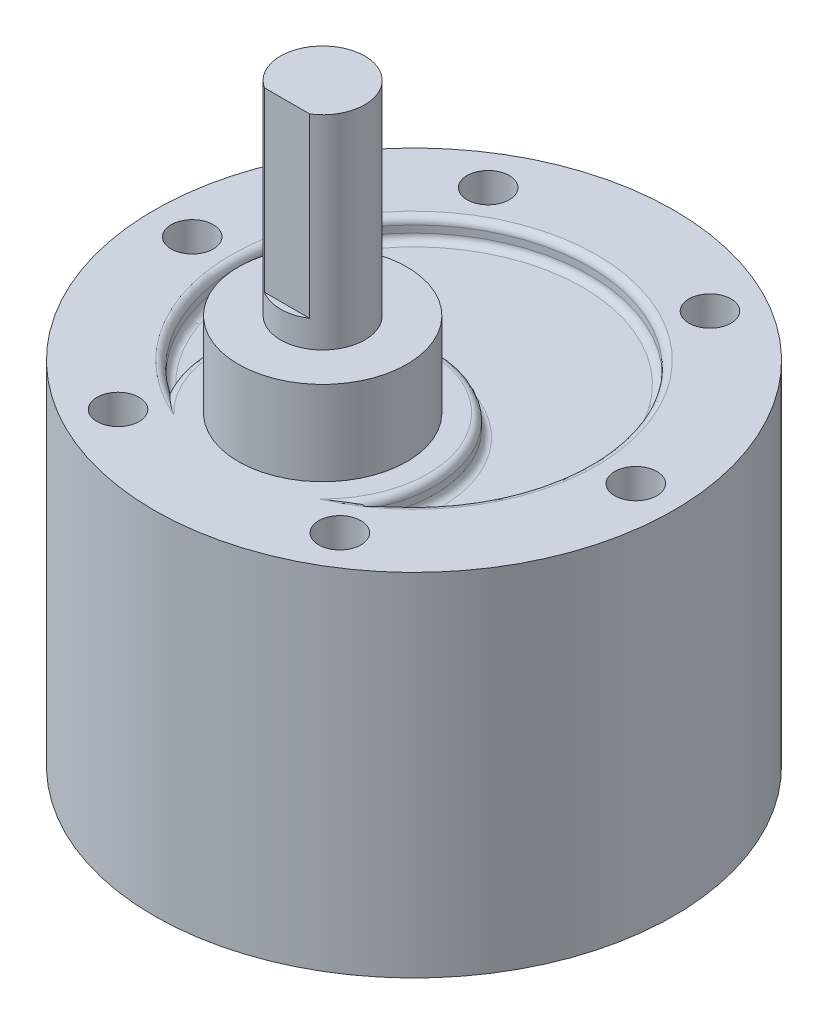
ISO-10303-21;
HEADER;
FILE_DESCRIPTION(('STEP AP214'),'2;1');
FILE_NAME('part.step','',(''),(''),'','','');
FILE_SCHEMA(('AUTOMOTIVE_DESIGN { 1 0 10303 214 1 1 1 1 }'));
ENDSEC;
DATA;
#1=APPLICATION_CONTEXT('core data for automotive mechanical design processes');
#2=APPLICATION_PROTOCOL_DEFINITION('international standard','automotive_design',2000,#1);
#3=PRODUCT_CONTEXT('',#1,'mechanical');
#4=PRODUCT('Part','Part','',(#3));
#5=PRODUCT_RELATED_PRODUCT_CATEGORY('part','',(#4));
#6=PRODUCT_DEFINITION_FORMATION('','',#4);
#7=PRODUCT_DEFINITION_CONTEXT('part definition',#1,'design');
#8=PRODUCT_DEFINITION('design','',#6,#7);
#9=PRODUCT_DEFINITION_SHAPE('','',#8);
#10=(LENGTH_UNIT() NAMED_UNIT(*) SI_UNIT(.MILLI.,.METRE.));
#11=(NAMED_UNIT(*) PLANE_ANGLE_UNIT() SI_UNIT($,.RADIAN.));
#12=(NAMED_UNIT(*) SI_UNIT($,.STERADIAN.) SOLID_ANGLE_UNIT());
#13=UNCERTAINTY_MEASURE_WITH_UNIT(LENGTH_MEASURE(1.E-05),#10,'distance_accuracy_value','');
#14=(GEOMETRIC_REPRESENTATION_CONTEXT(3) GLOBAL_UNCERTAINTY_ASSIGNED_CONTEXT((#13)) GLOBAL_UNIT_ASSIGNED_CONTEXT((#10,
#11,#12)) REPRESENTATION_CONTEXT('',''));
#15=CARTESIAN_POINT('',(0.,0.,0.));
#16=DIRECTION('',(0.,0.,1.));
#17=DIRECTION('',(1.,0.,0.));
#18=AXIS2_PLACEMENT_3D('',#15,#16,#17);
#19=CARTESIAN_POINT('',(0.,23.5,0.));
#20=DIRECTION('',(0.,1.,0.));
#21=DIRECTION('',(0.,0.,1.));
#22=AXIS2_PLACEMENT_3D('',#19,#20,#21);
#23=CYLINDRICAL_SURFACE('',#22,12.5);
#24=DIRECTION('',(0.,-1.,0.));
#25=VECTOR('',#24,1.);
#26=CARTESIAN_POINT('',(-7.014777301648,24.25,10.3461538461538));
#27=LINE('',#26,#25);
#28=CARTESIAN_POINT('',(-7.014777301648,24.,10.3461538461538));
#29=VERTEX_POINT('',#28);
#30=CARTESIAN_POINT('',(-7.014777301648,24.5,10.3461538461538));
#31=VERTEX_POINT('',#30);
#32=EDGE_CURVE('E162',#29,#31,#27,.F.);
#33=ORIENTED_EDGE('',*,*,#32,.F.);
#34=CARTESIAN_POINT('',(0.,24.,0.));
#35=DIRECTION('',(0.,1.,0.));
#36=DIRECTION('',(0.,0.,1.));
#37=AXIS2_PLACEMENT_3D('',#34,#35,#36);
#38=CIRCLE('',#37,12.5);
#39=CARTESIAN_POINT('',(7.014777301648,24.,10.3461538461538));
#40=VERTEX_POINT('',#39);
#41=EDGE_CURVE('E11',#29,#40,#38,.F.);
#42=ORIENTED_EDGE('',*,*,#41,.T.);
#43=DIRECTION('',(0.,-1.,0.));
#44=VECTOR('',#43,1.);
#45=CARTESIAN_POINT('',(7.014777301648,24.25,10.3461538461538));
#46=LINE('',#45,#44);
#47=CARTESIAN_POINT('',(7.014777301648,24.5,10.3461538461538));
#48=VERTEX_POINT('',#47);
#49=EDGE_CURVE('E165',#48,#40,#46,.T.);
#50=ORIENTED_EDGE('',*,*,#49,.F.);
#51=CARTESIAN_POINT('',(0.,24.5,0.));
#52=DIRECTION('',(0.,1.,0.));
#53=DIRECTION('',(0.,0.,1.));
#54=AXIS2_PLACEMENT_3D('',#51,#52,#53);
#55=CIRCLE('',#54,12.5);
#56=EDGE_CURVE('E48',#48,#31,#55,.T.);
#57=ORIENTED_EDGE('',*,*,#56,.T.);
#58=EDGE_LOOP('',(#33,#42,#50,#57));
#59=FACE_BOUND('',#58,.T.);
#60=ADVANCED_FACE('F34',(#59),#23,.F.);
#61=CARTESIAN_POINT('',(0.,25.,0.));
#62=DIRECTION('',(0.,-1.,0.));
#63=DIRECTION('',(0.,0.,-1.));
#64=AXIS2_PLACEMENT_3D('',#61,#62,#63);
#65=CYLINDRICAL_SURFACE('',#64,18.5);
#66=CARTESIAN_POINT('',(0.,25.,0.));
#67=DIRECTION('',(0.,1.,0.));
#68=DIRECTION('',(0.,0.,1.));
#69=AXIS2_PLACEMENT_3D('',#66,#67,#68);
#70=CIRCLE('',#69,18.5);
#71=CARTESIAN_POINT('',(0.,25.,18.5));
#72=VERTEX_POINT('',#71);
#73=EDGE_CURVE('E169',#72,#72,#70,.T.);
#74=ORIENTED_EDGE('',*,*,#73,.F.);
#75=EDGE_LOOP('',(#74));
#76=FACE_BOUND('',#75,.T.);
#77=CARTESIAN_POINT('',(0.,0.,0.));
#78=DIRECTION('',(0.,1.,0.));
#79=DIRECTION('',(0.,0.,1.));
#80=AXIS2_PLACEMENT_3D('',#77,#78,#79);
#81=CIRCLE('',#80,18.5);
#82=CARTESIAN_POINT('',(0.,0.,18.5));
#83=VERTEX_POINT('',#82);
#84=EDGE_CURVE('E168',#83,#83,#81,.T.);
#85=ORIENTED_EDGE('',*,*,#84,.T.);
#86=EDGE_LOOP('',(#85));
#87=FACE_BOUND('',#86,.T.);
#88=ADVANCED_FACE('F252',(#76,#87),#65,.T.);
#89=CARTESIAN_POINT('',(0.,25.,0.));
#90=DIRECTION('',(0.,1.,0.));
#91=DIRECTION('',(0.,0.,1.));
#92=AXIS2_PLACEMENT_3D('',#89,#90,#91);
#93=PLANE('',#92);
#94=CARTESIAN_POINT('',(0.,25.,0.));
#95=DIRECTION('',(0.,1.,0.));
#96=DIRECTION('',(0.,0.,1.));
#97=AXIS2_PLACEMENT_3D('',#94,#95,#96);
#98=CIRCLE('',#97,13.);
#99=CARTESIAN_POINT('',(-5.180756381687,25.,11.9230769230769));
#100=VERTEX_POINT('',#99);
#101=CARTESIAN_POINT('',(5.180756381687,25.,11.9230769230769));
#102=VERTEX_POINT('',#101);
#103=EDGE_CURVE('E63',#100,#102,#98,.F.);
#104=ORIENTED_EDGE('',*,*,#103,.T.);
#105=CARTESIAN_POINT('',(0.,25.,6.5));
#106=DIRECTION('',(0.,1.,0.));
#107=DIRECTION('',(0.,0.,1.));
#108=AXIS2_PLACEMENT_3D('',#105,#106,#107);
#109=CIRCLE('',#108,7.5);
#110=EDGE_CURVE('E186',#102,#100,#109,.T.);
#111=ORIENTED_EDGE('',*,*,#110,.T.);
#112=EDGE_LOOP('',(#104,#111));
#113=FACE_BOUND('',#112,.T.);
#114=CARTESIAN_POINT('',(15.4973401244707,25.,-0.287139454742051));
#115=DIRECTION('',(0.,1.,0.));
#116=DIRECTION('',(0.866025403784436,0.,-0.500000000000004));
#117=AXIS2_PLACEMENT_3D('',#114,#115,#116);
#118=CIRCLE('',#117,1.5);
#119=CARTESIAN_POINT('',(16.7963782301474,25.,-1.03713945474206));
#120=VERTEX_POINT('',#119);
#121=EDGE_CURVE('E119',#120,#120,#118,.T.);
#122=ORIENTED_EDGE('',*,*,#121,.F.);
#123=EDGE_LOOP('',(#122));
#124=FACE_BOUND('',#123,.T.);
#125=CARTESIAN_POINT('',(7.5,25.,-13.5646599662505));
#126=DIRECTION('',(0.,1.,0.));
#127=DIRECTION('',(0.,0.,-1.));
#128=AXIS2_PLACEMENT_3D('',#125,#126,#127);
#129=CIRCLE('',#128,1.5);
#130=CARTESIAN_POINT('',(7.5,25.,-15.0646599662505));
#131=VERTEX_POINT('',#130);
#132=EDGE_CURVE('E125',#131,#131,#129,.T.);
#133=ORIENTED_EDGE('',*,*,#132,.F.);
#134=EDGE_LOOP('',(#133));
#135=FACE_BOUND('',#134,.T.);
#136=CARTESIAN_POINT('',(-7.99734012447086,25.,-13.2775205115085));
#137=DIRECTION('',(0.,1.,0.));
#138=DIRECTION('',(-0.866025403784443,0.,-0.499999999999992));
#139=AXIS2_PLACEMENT_3D('',#136,#137,#138);
#140=CIRCLE('',#139,1.5);
#141=CARTESIAN_POINT('',(-9.29637823014752,25.,-14.0275205115085));
#142=VERTEX_POINT('',#141);
#143=EDGE_CURVE('E131',#142,#142,#140,.T.);
#144=ORIENTED_EDGE('',*,*,#143,.F.);
#145=EDGE_LOOP('',(#144));
#146=FACE_BOUND('',#145,.T.);
#147=CARTESIAN_POINT('',(-15.4973401244707,25.,0.28713945474216));
#148=DIRECTION('',(0.,1.,0.));
#149=DIRECTION('',(-0.866025403784433,0.,0.50000000000001));
#150=AXIS2_PLACEMENT_3D('',#147,#148,#149);
#151=CIRCLE('',#150,1.5);
#152=CARTESIAN_POINT('',(-16.7963782301474,25.,1.03713945474218));
#153=VERTEX_POINT('',#152);
#154=EDGE_CURVE('E137',#153,#153,#151,.T.);
#155=ORIENTED_EDGE('',*,*,#154,.F.);
#156=EDGE_LOOP('',(#155));
#157=FACE_BOUND('',#156,.T.);
#158=CARTESIAN_POINT('',(7.99734012447076,25.,13.2775205115085));
#159=DIRECTION('',(0.,1.,0.));
#160=DIRECTION('',(0.86602540378444,0.,0.499999999999998));
#161=AXIS2_PLACEMENT_3D('',#158,#159,#160);
#162=CIRCLE('',#161,1.5);
#163=CARTESIAN_POINT('',(9.29637823014743,25.,14.0275205115085));
#164=VERTEX_POINT('',#163);
#165=EDGE_CURVE('E118',#164,#164,#162,.T.);
#166=ORIENTED_EDGE('',*,*,#165,.F.);
#167=EDGE_LOOP('',(#166));
#168=FACE_BOUND('',#167,.T.);
#169=CARTESIAN_POINT('',(-7.5,25.,13.5646599662505));
#170=DIRECTION('',(0.,1.,0.));
#171=DIRECTION('',(0.,0.,1.));
#172=AXIS2_PLACEMENT_3D('',#169,#170,#171);
#173=CIRCLE('',#172,1.5);
#174=CARTESIAN_POINT('',(-7.5,25.,15.0646599662505));
#175=VERTEX_POINT('',#174);
#176=EDGE_CURVE('E144',#175,#175,#173,.T.);
#177=ORIENTED_EDGE('',*,*,#176,.F.);
#178=EDGE_LOOP('',(#177));
#179=FACE_BOUND('',#178,.T.);
#180=ORIENTED_EDGE('',*,*,#73,.T.);
#181=EDGE_LOOP('',(#180));
#182=FACE_BOUND('',#181,.T.);
#183=CARTESIAN_POINT('',(0.,25.,6.5));
#184=DIRECTION('',(0.,1.,0.));
#185=DIRECTION('',(0.,0.,1.));
#186=AXIS2_PLACEMENT_3D('',#183,#184,#185);
#187=CIRCLE('',#186,6.);
#188=CARTESIAN_POINT('',(0.,25.,12.5));
#189=VERTEX_POINT('',#188);
#190=EDGE_CURVE('E159',#189,#189,#187,.T.);
#191=ORIENTED_EDGE('',*,*,#190,.F.);
#192=EDGE_LOOP('',(#191));
#193=FACE_BOUND('',#192,.T.);
#194=ADVANCED_FACE('F247',(#113,#124,#135,#146,#157,#168,#179,#182,#193),#93,.T.);
#195=CARTESIAN_POINT('',(0.,0.,0.));
#196=DIRECTION('',(0.,1.,0.));
#197=DIRECTION('',(0.,0.,1.));
#198=AXIS2_PLACEMENT_3D('',#195,#196,#197);
#199=PLANE('',#198);
#200=ORIENTED_EDGE('',*,*,#84,.F.);
#201=EDGE_LOOP('',(#200));
#202=FACE_BOUND('',#201,.T.);
#203=ADVANCED_FACE('F239',(#202),#199,.F.);
#204=CARTESIAN_POINT('',(0.,23.5,0.));
#205=DIRECTION('',(0.,1.,0.));
#206=DIRECTION('',(0.,0.,1.));
#207=AXIS2_PLACEMENT_3D('',#204,#205,#206);
#208=PLANE('',#207);
#209=CARTESIAN_POINT('',(0.,23.5,0.));
#210=DIRECTION('',(0.,1.,0.));
#211=DIRECTION('',(0.,0.,1.));
#212=AXIS2_PLACEMENT_3D('',#209,#210,#211);
#213=CIRCLE('',#212,12.);
#214=CARTESIAN_POINT('',(8.19149508429178,23.5,8.76923076923077));
#215=VERTEX_POINT('',#214);
#216=CARTESIAN_POINT('',(-8.19149508429178,23.5,8.76923076923077));
#217=VERTEX_POINT('',#216);
#218=EDGE_CURVE('E180',#215,#217,#213,.T.);
#219=ORIENTED_EDGE('',*,*,#218,.T.);
#220=CARTESIAN_POINT('',(0.,23.5,6.5));
#221=DIRECTION('',(0.,1.,0.));
#222=DIRECTION('',(0.,0.,1.));
#223=AXIS2_PLACEMENT_3D('',#220,#221,#222);
#224=CIRCLE('',#223,8.5);
#225=EDGE_CURVE('E182',#217,#215,#224,.F.);
#226=ORIENTED_EDGE('',*,*,#225,.T.);
#227=EDGE_LOOP('',(#219,#226));
#228=FACE_BOUND('',#227,.T.);
#229=ADVANCED_FACE('F237',(#228),#208,.T.);
#230=CARTESIAN_POINT('',(0.,25.,6.5));
#231=DIRECTION('',(0.,-1.,0.));
#232=DIRECTION('',(0.,0.,-1.));
#233=AXIS2_PLACEMENT_3D('',#230,#231,#232);
#234=CYLINDRICAL_SURFACE('',#233,8.);
#235=ORIENTED_EDGE('',*,*,#49,.T.);
#236=CARTESIAN_POINT('',(0.,24.,6.5));
#237=DIRECTION('',(0.,1.,0.));
#238=DIRECTION('',(0.,0.,1.));
#239=AXIS2_PLACEMENT_3D('',#236,#237,#238);
#240=CIRCLE('',#239,8.);
#241=EDGE_CURVE('E177',#40,#29,#240,.T.);
#242=ORIENTED_EDGE('',*,*,#241,.T.);
#243=ORIENTED_EDGE('',*,*,#32,.T.);
#244=CARTESIAN_POINT('',(0.,24.5,6.5));
#245=DIRECTION('',(0.,1.,0.));
#246=DIRECTION('',(0.,0.,1.));
#247=AXIS2_PLACEMENT_3D('',#244,#245,#246);
#248=CIRCLE('',#247,8.);
#249=EDGE_CURVE('E172',#31,#48,#248,.F.);
#250=ORIENTED_EDGE('',*,*,#249,.T.);
#251=EDGE_LOOP('',(#235,#242,#243,#250));
#252=FACE_BOUND('',#251,.T.);
#253=ADVANCED_FACE('F228',(#252),#234,.T.);
#254=CARTESIAN_POINT('',(0.,31.,6.5));
#255=DIRECTION('',(0.,-1.,0.));
#256=DIRECTION('',(0.,0.,-1.));
#257=AXIS2_PLACEMENT_3D('',#254,#255,#256);
#258=CYLINDRICAL_SURFACE('',#257,6.);
#259=ORIENTED_EDGE('',*,*,#190,.T.);
#260=EDGE_LOOP('',(#259));
#261=FACE_BOUND('',#260,.T.);
#262=CARTESIAN_POINT('',(0.,31.,6.5));
#263=DIRECTION('',(0.,1.,0.));
#264=DIRECTION('',(0.,0.,1.));
#265=AXIS2_PLACEMENT_3D('',#262,#263,#264);
#266=CIRCLE('',#265,6.);
#267=CARTESIAN_POINT('',(0.,31.,12.5));
#268=VERTEX_POINT('',#267);
#269=EDGE_CURVE('E154',#268,#268,#266,.T.);
#270=ORIENTED_EDGE('',*,*,#269,.F.);
#271=EDGE_LOOP('',(#270));
#272=FACE_BOUND('',#271,.T.);
#273=ADVANCED_FACE('F245',(#261,#272),#258,.T.);
#274=CARTESIAN_POINT('',(0.,31.,6.5));
#275=DIRECTION('',(0.,1.,0.));
#276=DIRECTION('',(0.,0.,1.));
#277=AXIS2_PLACEMENT_3D('',#274,#275,#276);
#278=PLANE('',#277);
#279=CARTESIAN_POINT('',(0.,31.,6.5));
#280=DIRECTION('',(0.,1.,0.));
#281=DIRECTION('',(0.,0.,1.));
#282=AXIS2_PLACEMENT_3D('',#279,#280,#281);
#283=CIRCLE('',#282,3.);
#284=CARTESIAN_POINT('',(0.,31.,9.5));
#285=VERTEX_POINT('',#284);
#286=EDGE_CURVE('E150',#285,#285,#283,.T.);
#287=ORIENTED_EDGE('',*,*,#286,.F.);
#288=EDGE_LOOP('',(#287));
#289=FACE_BOUND('',#288,.T.);
#290=ORIENTED_EDGE('',*,*,#269,.T.);
#291=EDGE_LOOP('',(#290));
#292=FACE_BOUND('',#291,.T.);
#293=ADVANCED_FACE('F280',(#289,#292),#278,.T.);
#294=CARTESIAN_POINT('',(0.,45.5,6.5));
#295=DIRECTION('',(0.,-1.,0.));
#296=DIRECTION('',(0.,0.,-1.));
#297=AXIS2_PLACEMENT_3D('',#294,#295,#296);
#298=CYLINDRICAL_SURFACE('',#297,3.);
#299=CARTESIAN_POINT('',(0.,45.5,6.5));
#300=DIRECTION('',(0.,1.,0.));
#301=DIRECTION('',(0.,0.,1.));
#302=AXIS2_PLACEMENT_3D('',#299,#300,#301);
#303=CIRCLE('',#302,3.);
#304=CARTESIAN_POINT('',(1.61,45.5,9.03138302119612));
#305=VERTEX_POINT('',#304);
#306=CARTESIAN_POINT('',(-1.61,45.5,9.03138302119612));
#307=VERTEX_POINT('',#306);
#308=EDGE_CURVE('E109',#305,#307,#303,.T.);
#309=ORIENTED_EDGE('',*,*,#308,.F.);
#310=DIRECTION('',(0.,1.,0.));
#311=VECTOR('',#310,1.);
#312=CARTESIAN_POINT('',(1.61,32.9,9.03138302119612));
#313=LINE('',#312,#311);
#314=CARTESIAN_POINT('',(1.61,32.9,9.03138302119612));
#315=VERTEX_POINT('',#314);
#316=EDGE_CURVE('E56',#315,#305,#313,.T.);
#317=ORIENTED_EDGE('',*,*,#316,.F.);
#318=CARTESIAN_POINT('',(0.,32.9,6.5));
#319=DIRECTION('',(0.,1.,0.));
#320=DIRECTION('',(0.,0.,1.));
#321=AXIS2_PLACEMENT_3D('',#318,#319,#320);
#322=CIRCLE('',#321,3.);
#323=CARTESIAN_POINT('',(-1.61,32.9,9.03138302119612));
#324=VERTEX_POINT('',#323);
#325=EDGE_CURVE('E95',#324,#315,#322,.T.);
#326=ORIENTED_EDGE('',*,*,#325,.F.);
#327=DIRECTION('',(0.,1.,0.));
#328=VECTOR('',#327,1.);
#329=CARTESIAN_POINT('',(-1.61,32.9,9.03138302119612));
#330=LINE('',#329,#328);
#331=EDGE_CURVE('E103',#324,#307,#330,.T.);
#332=ORIENTED_EDGE('',*,*,#331,.T.);
#333=EDGE_LOOP('',(#309,#317,#326,#332));
#334=FACE_BOUND('',#333,.T.);
#335=ORIENTED_EDGE('',*,*,#286,.T.);
#336=EDGE_LOOP('',(#335));
#337=FACE_BOUND('',#336,.T.);
#338=ADVANCED_FACE('F106',(#334,#337),#298,.T.);
#339=CARTESIAN_POINT('',(0.,45.5,6.5));
#340=DIRECTION('',(0.,1.,0.));
#341=DIRECTION('',(0.,0.,1.));
#342=AXIS2_PLACEMENT_3D('',#339,#340,#341);
#343=PLANE('',#342);
#344=DIRECTION('',(-1.,0.,0.));
#345=VECTOR('',#344,1.);
#346=CARTESIAN_POINT('',(-1.61,45.5,9.03138302119612));
#347=LINE('',#346,#345);
#348=EDGE_CURVE('E100',#305,#307,#347,.T.);
#349=ORIENTED_EDGE('',*,*,#348,.F.);
#350=ORIENTED_EDGE('',*,*,#308,.T.);
#351=EDGE_LOOP('',(#349,#350));
#352=FACE_BOUND('',#351,.T.);
#353=ADVANCED_FACE('F290',(#352),#343,.T.);
#354=CARTESIAN_POINT('',(-7.5,21.,13.5646599662505));
#355=DIRECTION('',(0.,1.,0.));
#356=DIRECTION('',(0.,0.,1.));
#357=AXIS2_PLACEMENT_3D('',#354,#355,#356);
#358=CYLINDRICAL_SURFACE('',#357,1.5);
#359=CARTESIAN_POINT('',(-7.5,21.,13.5646599662505));
#360=DIRECTION('',(0.,1.,0.));
#361=DIRECTION('',(0.,0.,1.));
#362=AXIS2_PLACEMENT_3D('',#359,#360,#361);
#363=CIRCLE('',#362,1.5);
#364=CARTESIAN_POINT('',(-7.5,21.,15.0646599662505));
#365=VERTEX_POINT('',#364);
#366=EDGE_CURVE('E147',#365,#365,#363,.T.);
#367=ORIENTED_EDGE('',*,*,#366,.F.);
#368=EDGE_LOOP('',(#367));
#369=FACE_BOUND('',#368,.T.);
#370=ORIENTED_EDGE('',*,*,#176,.T.);
#371=EDGE_LOOP('',(#370));
#372=FACE_BOUND('',#371,.T.);
#373=ADVANCED_FACE('F296',(#369,#372),#358,.F.);
#374=CARTESIAN_POINT('',(0.,21.,0.));
#375=DIRECTION('',(0.,1.,0.));
#376=DIRECTION('',(0.,0.,1.));
#377=AXIS2_PLACEMENT_3D('',#374,#375,#376);
#378=PLANE('',#377);
#379=ORIENTED_EDGE('',*,*,#366,.T.);
#380=EDGE_LOOP('',(#379));
#381=FACE_BOUND('',#380,.T.);
#382=ADVANCED_FACE('F300',(#381),#378,.T.);
#383=CARTESIAN_POINT('',(7.99734012447076,21.,13.2775205115085));
#384=DIRECTION('',(0.,1.,0.));
#385=DIRECTION('',(0.,0.,1.));
#386=AXIS2_PLACEMENT_3D('',#383,#384,#385);
#387=CYLINDRICAL_SURFACE('',#386,1.5);
#388=CARTESIAN_POINT('',(7.99734012447076,21.,13.2775205115085));
#389=DIRECTION('',(0.,1.,0.));
#390=DIRECTION('',(0.86602540378444,0.,0.499999999999998));
#391=AXIS2_PLACEMENT_3D('',#388,#389,#390);
#392=CIRCLE('',#391,1.5);
#393=CARTESIAN_POINT('',(9.29637823014743,21.,14.0275205115085));
#394=VERTEX_POINT('',#393);
#395=EDGE_CURVE('E141',#394,#394,#392,.T.);
#396=ORIENTED_EDGE('',*,*,#395,.F.);
#397=EDGE_LOOP('',(#396));
#398=FACE_BOUND('',#397,.T.);
#399=ORIENTED_EDGE('',*,*,#165,.T.);
#400=EDGE_LOOP('',(#399));
#401=FACE_BOUND('',#400,.T.);
#402=ADVANCED_FACE('F304',(#398,#401),#387,.F.);
#403=CARTESIAN_POINT('',(0.,21.,0.));
#404=DIRECTION('',(0.,1.,0.));
#405=DIRECTION('',(0.86602540378444,0.,0.499999999999998));
#406=AXIS2_PLACEMENT_3D('',#403,#404,#405);
#407=PLANE('',#406);
#408=ORIENTED_EDGE('',*,*,#395,.T.);
#409=EDGE_LOOP('',(#408));
#410=FACE_BOUND('',#409,.T.);
#411=ADVANCED_FACE('F308',(#410),#407,.T.);
#412=CARTESIAN_POINT('',(-15.4973401244707,21.,0.28713945474216));
#413=DIRECTION('',(0.,1.,0.));
#414=DIRECTION('',(0.,0.,1.));
#415=AXIS2_PLACEMENT_3D('',#412,#413,#414);
#416=CYLINDRICAL_SURFACE('',#415,1.5);
#417=CARTESIAN_POINT('',(-15.4973401244707,21.,0.28713945474216));
#418=DIRECTION('',(0.,1.,0.));
#419=DIRECTION('',(-0.866025403784433,0.,0.50000000000001));
#420=AXIS2_PLACEMENT_3D('',#417,#418,#419);
#421=CIRCLE('',#420,1.5);
#422=CARTESIAN_POINT('',(-16.7963782301474,21.,1.03713945474218));
#423=VERTEX_POINT('',#422);
#424=EDGE_CURVE('E134',#423,#423,#421,.T.);
#425=ORIENTED_EDGE('',*,*,#424,.F.);
#426=EDGE_LOOP('',(#425));
#427=FACE_BOUND('',#426,.T.);
#428=ORIENTED_EDGE('',*,*,#154,.T.);
#429=EDGE_LOOP('',(#428));
#430=FACE_BOUND('',#429,.T.);
#431=ADVANCED_FACE('F312',(#427,#430),#416,.F.);
#432=CARTESIAN_POINT('',(0.,21.,0.));
#433=DIRECTION('',(0.,1.,0.));
#434=DIRECTION('',(-0.866025403784433,0.,0.50000000000001));
#435=AXIS2_PLACEMENT_3D('',#432,#433,#434);
#436=PLANE('',#435);
#437=ORIENTED_EDGE('',*,*,#424,.T.);
#438=EDGE_LOOP('',(#437));
#439=FACE_BOUND('',#438,.T.);
#440=ADVANCED_FACE('F316',(#439),#436,.T.);
#441=CARTESIAN_POINT('',(-7.99734012447086,21.,-13.2775205115085));
#442=DIRECTION('',(0.,1.,0.));
#443=DIRECTION('',(0.,0.,1.));
#444=AXIS2_PLACEMENT_3D('',#441,#442,#443);
#445=CYLINDRICAL_SURFACE('',#444,1.5);
#446=CARTESIAN_POINT('',(-7.99734012447086,21.,-13.2775205115085));
#447=DIRECTION('',(0.,1.,0.));
#448=DIRECTION('',(-0.866025403784443,0.,-0.499999999999992));
#449=AXIS2_PLACEMENT_3D('',#446,#447,#448);
#450=CIRCLE('',#449,1.5);
#451=CARTESIAN_POINT('',(-9.29637823014752,21.,-14.0275205115085));
#452=VERTEX_POINT('',#451);
#453=EDGE_CURVE('E128',#452,#452,#450,.T.);
#454=ORIENTED_EDGE('',*,*,#453,.F.);
#455=EDGE_LOOP('',(#454));
#456=FACE_BOUND('',#455,.T.);
#457=ORIENTED_EDGE('',*,*,#143,.T.);
#458=EDGE_LOOP('',(#457));
#459=FACE_BOUND('',#458,.T.);
#460=ADVANCED_FACE('F320',(#456,#459),#445,.F.);
#461=CARTESIAN_POINT('',(0.,21.,0.));
#462=DIRECTION('',(0.,1.,0.));
#463=DIRECTION('',(-0.866025403784443,0.,-0.499999999999992));
#464=AXIS2_PLACEMENT_3D('',#461,#462,#463);
#465=PLANE('',#464);
#466=ORIENTED_EDGE('',*,*,#453,.T.);
#467=EDGE_LOOP('',(#466));
#468=FACE_BOUND('',#467,.T.);
#469=ADVANCED_FACE('F324',(#468),#465,.T.);
#470=CARTESIAN_POINT('',(7.5,21.,-13.5646599662505));
#471=DIRECTION('',(0.,1.,0.));
#472=DIRECTION('',(0.,0.,1.));
#473=AXIS2_PLACEMENT_3D('',#470,#471,#472);
#474=CYLINDRICAL_SURFACE('',#473,1.5);
#475=CARTESIAN_POINT('',(7.5,21.,-13.5646599662505));
#476=DIRECTION('',(0.,1.,0.));
#477=DIRECTION('',(0.,0.,-1.));
#478=AXIS2_PLACEMENT_3D('',#475,#476,#477);
#479=CIRCLE('',#478,1.5);
#480=CARTESIAN_POINT('',(7.5,21.,-15.0646599662505));
#481=VERTEX_POINT('',#480);
#482=EDGE_CURVE('E122',#481,#481,#479,.T.);
#483=ORIENTED_EDGE('',*,*,#482,.F.);
#484=EDGE_LOOP('',(#483));
#485=FACE_BOUND('',#484,.T.);
#486=ORIENTED_EDGE('',*,*,#132,.T.);
#487=EDGE_LOOP('',(#486));
#488=FACE_BOUND('',#487,.T.);
#489=ADVANCED_FACE('F328',(#485,#488),#474,.F.);
#490=CARTESIAN_POINT('',(0.,21.,0.));
#491=DIRECTION('',(0.,1.,0.));
#492=DIRECTION('',(0.,0.,-1.));
#493=AXIS2_PLACEMENT_3D('',#490,#491,#492);
#494=PLANE('',#493);
#495=ORIENTED_EDGE('',*,*,#482,.T.);
#496=EDGE_LOOP('',(#495));
#497=FACE_BOUND('',#496,.T.);
#498=ADVANCED_FACE('F332',(#497),#494,.T.);
#499=CARTESIAN_POINT('',(15.4973401244707,21.,-0.287139454742051));
#500=DIRECTION('',(0.,1.,0.));
#501=DIRECTION('',(0.,0.,1.));
#502=AXIS2_PLACEMENT_3D('',#499,#500,#501);
#503=CYLINDRICAL_SURFACE('',#502,1.5);
#504=CARTESIAN_POINT('',(15.4973401244707,21.,-0.287139454742051));
#505=DIRECTION('',(0.,1.,0.));
#506=DIRECTION('',(0.866025403784436,0.,-0.500000000000004));
#507=AXIS2_PLACEMENT_3D('',#504,#505,#506);
#508=CIRCLE('',#507,1.5);
#509=CARTESIAN_POINT('',(16.7963782301474,21.,-1.03713945474206));
#510=VERTEX_POINT('',#509);
#511=EDGE_CURVE('E115',#510,#510,#508,.T.);
#512=ORIENTED_EDGE('',*,*,#511,.F.);
#513=EDGE_LOOP('',(#512));
#514=FACE_BOUND('',#513,.T.);
#515=ORIENTED_EDGE('',*,*,#121,.T.);
#516=EDGE_LOOP('',(#515));
#517=FACE_BOUND('',#516,.T.);
#518=ADVANCED_FACE('F336',(#514,#517),#503,.F.);
#519=CARTESIAN_POINT('',(0.,21.,0.));
#520=DIRECTION('',(0.,1.,0.));
#521=DIRECTION('',(0.866025403784436,0.,-0.500000000000004));
#522=AXIS2_PLACEMENT_3D('',#519,#520,#521);
#523=PLANE('',#522);
#524=ORIENTED_EDGE('',*,*,#511,.T.);
#525=EDGE_LOOP('',(#524));
#526=FACE_BOUND('',#525,.T.);
#527=ADVANCED_FACE('F207',(#526),#523,.T.);
#528=CARTESIAN_POINT('',(0.,24.,0.));
#529=DIRECTION('',(0.,1.,0.));
#530=DIRECTION('',(0.,0.,1.));
#531=AXIS2_PLACEMENT_3D('',#528,#529,#530);
#532=TOROIDAL_SURFACE('',#531,12.,0.5);
#533=CARTESIAN_POINT('',(-7.014777301648,24.,10.3461538461538));
#534=CARTESIAN_POINT('',(-7.01475442918476,23.9915923736462,10.3461784879439));
#535=CARTESIAN_POINT('',(-7.01538477166337,23.9832396623425,10.3454862693069));
#536=CARTESIAN_POINT('',(-7.01772080007973,23.9670206322712,10.3429177941814));
#537=CARTESIAN_POINT('',(-7.01940715045433,23.9591483030969,10.3410628270888));
#538=CARTESIAN_POINT('',(-7.02413757927974,23.9421583884327,10.3358533875347));
#539=CARTESIAN_POINT('',(-7.02740813013303,23.9331852546101,10.3322483776561));
#540=CARTESIAN_POINT('',(-7.03485906977461,23.9160706486679,10.3240197451808));
#541=CARTESIAN_POINT('',(-7.03904598852707,23.9079357956427,10.3193888088627));
#542=CARTESIAN_POINT('',(-7.05178893466808,23.8859344305451,10.3052631403329));
#543=CARTESIAN_POINT('',(-7.0610536750115,23.8730142340979,10.2949581215688));
#544=CARTESIAN_POINT('',(-7.08056058954089,23.8491280867938,10.2731582004436));
#545=CARTESIAN_POINT('',(-7.09080449283763,23.8381656949054,10.2616611899885));
#546=CARTESIAN_POINT('',(-7.11876199646768,23.8108780437832,10.2301274294606));
#547=CARTESIAN_POINT('',(-7.1369478967437,23.7957816693751,10.2094575664443));
#548=CARTESIAN_POINT('',(-7.17394885718459,23.7680463846059,10.1670344783538));
#549=CARTESIAN_POINT('',(-7.19276536295881,23.7554136481851,10.1452786988679));
#550=CARTESIAN_POINT('',(-7.23078286073721,23.7318630689856,10.1009298317673));
#551=CARTESIAN_POINT('',(-7.24998546439757,23.7209557630854,10.0783325678163));
#552=CARTESIAN_POINT('',(-7.28846237127119,23.700532816483,10.0326401770113));
#553=CARTESIAN_POINT('',(-7.30773656176675,23.6910155327911,10.009545675565));
#554=CARTESIAN_POINT('',(-7.36525926504657,23.664238506994,9.93998425454603));
#555=CARTESIAN_POINT('',(-7.40350280176424,23.6485830946159,9.89289582281786));
#556=CARTESIAN_POINT('',(-7.47957812610475,23.6203534567656,9.79746485103161));
#557=CARTESIAN_POINT('',(-7.51740965636797,23.607781062207,9.74912158451676));
#558=CARTESIAN_POINT('',(-7.59253916374873,23.5850893203262,9.65128958576661));
#559=CARTESIAN_POINT('',(-7.62983584084739,23.5749752258381,9.60179864396841));
#560=CARTESIAN_POINT('',(-7.70370141090186,23.5568689504504,9.50189061074442));
#561=CARTESIAN_POINT('',(-7.74027019908866,23.548877072999,9.45147338797379));
#562=CARTESIAN_POINT('',(-7.84858937653482,23.5277723044041,9.2992134949019));
#563=CARTESIAN_POINT('',(-7.9191411288503,23.5174762536081,9.19611722572806));
#564=CARTESIAN_POINT('',(-8.05653983642603,23.5036526477541,8.98723748776893));
#565=CARTESIAN_POINT('',(-8.12339154978617,23.5001161940443,8.88145773789875));
#566=CARTESIAN_POINT('',(-8.18935583025457,23.5000009459945,8.77275948297781));
#567=CARTESIAN_POINT('',(-8.19042572397537,23.5000000071941,8.77099528261201));
#568=CARTESIAN_POINT('',(-8.19149508429178,23.5,8.76923076923077));
#569=B_SPLINE_CURVE_WITH_KNOTS('',3,(#533,#534,#535,#536,#537,#538,#539,#540,#541,#542,#543,
#544,#545,#546,#547,#548,#549,#550,#551,#552,#553,#554,#555,#556,#557,#558,#559,#560,#561,#562,
#563,#564,#565,#566,#567,#568),.UNSPECIFIED.,.F.,.F.,(4,2,2,2,2,2,2,2,2,2,2,2,2,2,2,2,2,4),(0.,
0.0250834702562871,0.0497205751147341,0.0801707890679493,0.110845495481893,0.167367752383616,
0.223991734237084,0.317944975339732,0.412130722591282,0.506871117703167,0.601498608442881,
0.789306183401524,0.977225023107635,1.16554194098881,1.35388577115401,1.72963329304604,
2.10488582161404,2.11107562540091),.UNSPECIFIED.);
#570=EDGE_CURVE('E189',#217,#29,#569,.F.);
#571=ORIENTED_EDGE('',*,*,#570,.F.);
#572=ORIENTED_EDGE('',*,*,#218,.F.);
#573=CARTESIAN_POINT('',(7.014777301648,24.,10.3461538461538));
#574=CARTESIAN_POINT('',(7.01475442918476,23.9915923736462,10.3461784879439));
#575=CARTESIAN_POINT('',(7.01538477166337,23.9832396623425,10.3454862693069));
#576=CARTESIAN_POINT('',(7.01772080007973,23.9670206322712,10.3429177941814));
#577=CARTESIAN_POINT('',(7.01940715045433,23.9591483030969,10.3410628270888));
#578=CARTESIAN_POINT('',(7.02413757927974,23.9421583884327,10.3358533875347));
#579=CARTESIAN_POINT('',(7.02740813013303,23.9331852546101,10.3322483776561));
#580=CARTESIAN_POINT('',(7.03485906977461,23.9160706486679,10.3240197451808));
#581=CARTESIAN_POINT('',(7.03904598852707,23.9079357956427,10.3193888088627));
#582=CARTESIAN_POINT('',(7.05178893466808,23.8859344305451,10.3052631403329));
#583=CARTESIAN_POINT('',(7.0610536750115,23.8730142340979,10.2949581215688));
#584=CARTESIAN_POINT('',(7.08056058954089,23.8491280867938,10.2731582004436));
#585=CARTESIAN_POINT('',(7.09080449283763,23.8381656949054,10.2616611899885));
#586=CARTESIAN_POINT('',(7.11876199646768,23.8108780437832,10.2301274294606));
#587=CARTESIAN_POINT('',(7.1369478967437,23.7957816693751,10.2094575664443));
#588=CARTESIAN_POINT('',(7.17394885718459,23.7680463846059,10.1670344783538));
#589=CARTESIAN_POINT('',(7.19276536295881,23.7554136481851,10.1452786988679));
#590=CARTESIAN_POINT('',(7.23078286073721,23.7318630689856,10.1009298317673));
#591=CARTESIAN_POINT('',(7.24998546439757,23.7209557630854,10.0783325678163));
#592=CARTESIAN_POINT('',(7.28846237127119,23.700532816483,10.0326401770113));
#593=CARTESIAN_POINT('',(7.30773656176675,23.6910155327911,10.009545675565));
#594=CARTESIAN_POINT('',(7.36525926504657,23.664238506994,9.93998425454603));
#595=CARTESIAN_POINT('',(7.40350280176424,23.6485830946159,9.89289582281786));
#596=CARTESIAN_POINT('',(7.47957812610475,23.6203534567656,9.79746485103161));
#597=CARTESIAN_POINT('',(7.51740965636797,23.607781062207,9.74912158451676));
#598=CARTESIAN_POINT('',(7.59253916374873,23.5850893203262,9.65128958576661));
#599=CARTESIAN_POINT('',(7.62983584084739,23.5749752258381,9.60179864396841));
#600=CARTESIAN_POINT('',(7.70370141090186,23.5568689504504,9.50189061074442));
#601=CARTESIAN_POINT('',(7.74027019908866,23.548877072999,9.45147338797379));
#602=CARTESIAN_POINT('',(7.84858937653482,23.5277723044041,9.2992134949019));
#603=CARTESIAN_POINT('',(7.9191411288503,23.5174762536081,9.19611722572806));
#604=CARTESIAN_POINT('',(8.05653983642603,23.5036526477541,8.98723748776893));
#605=CARTESIAN_POINT('',(8.12339154978617,23.5001161940443,8.88145773789875));
#606=CARTESIAN_POINT('',(8.18935583025457,23.5000009459945,8.77275948297781));
#607=CARTESIAN_POINT('',(8.19042572397537,23.5000000071941,8.77099528261201));
#608=CARTESIAN_POINT('',(8.19149508429178,23.5,8.76923076923077));
#609=B_SPLINE_CURVE_WITH_KNOTS('',3,(#573,#574,#575,#576,#577,#578,#579,#580,#581,#582,#583,
#584,#585,#586,#587,#588,#589,#590,#591,#592,#593,#594,#595,#596,#597,#598,#599,#600,#601,#602,
#603,#604,#605,#606,#607,#608),.UNSPECIFIED.,.F.,.F.,(4,2,2,2,2,2,2,2,2,2,2,2,2,2,2,2,2,4),(0.,
0.0250834702562871,0.0497205751147341,0.0801707890679493,0.110845495481893,0.167367752383616,
0.223991734237084,0.317944975339732,0.412130722591282,0.506871117703167,0.601498608442881,
0.789306183401524,0.977225023107635,1.16554194098881,1.35388577115401,1.72963329304604,
2.10488582161404,2.11107562540091),.UNSPECIFIED.);
#610=EDGE_CURVE('E140',#40,#215,#609,.T.);
#611=ORIENTED_EDGE('',*,*,#610,.F.);
#612=ORIENTED_EDGE('',*,*,#41,.F.);
#613=EDGE_LOOP('',(#571,#572,#611,#612));
#614=FACE_BOUND('',#613,.T.);
#615=ADVANCED_FACE('F204',(#614),#532,.F.);
#616=CARTESIAN_POINT('',(0.,24.,6.5));
#617=DIRECTION('',(0.,1.,0.));
#618=DIRECTION('',(0.,0.,1.));
#619=AXIS2_PLACEMENT_3D('',#616,#617,#618);
#620=TOROIDAL_SURFACE('',#619,8.5,0.5);
#621=ORIENTED_EDGE('',*,*,#610,.T.);
#622=ORIENTED_EDGE('',*,*,#225,.F.);
#623=ORIENTED_EDGE('',*,*,#570,.T.);
#624=ORIENTED_EDGE('',*,*,#241,.F.);
#625=EDGE_LOOP('',(#621,#622,#623,#624));
#626=FACE_BOUND('',#625,.T.);
#627=ADVANCED_FACE('F201',(#626),#620,.F.);
#628=CARTESIAN_POINT('',(0.,24.5,0.));
#629=DIRECTION('',(0.,1.,0.));
#630=DIRECTION('',(0.,0.,1.));
#631=AXIS2_PLACEMENT_3D('',#628,#629,#630);
#632=TOROIDAL_SURFACE('',#631,13.,0.5);
#633=CARTESIAN_POINT('',(-7.014777301648,24.5,10.3461538461538));
#634=CARTESIAN_POINT('',(-7.01479902571446,24.5083477669686,10.346129482729));
#635=CARTESIAN_POINT('',(-7.01417850843926,24.5166431103164,10.3468119775782));
#636=CARTESIAN_POINT('',(-7.01187152274427,24.5327577745993,10.3493463147974));
#637=CARTESIAN_POINT('',(-7.01020373696805,24.5405828577153,10.3511776617845));
#638=CARTESIAN_POINT('',(-7.00552749718299,24.5574197487715,10.3563066369921));
#639=CARTESIAN_POINT('',(-7.00229959279801,24.5662933861686,10.3598438946601));
#640=CARTESIAN_POINT('',(-6.99492291656584,24.5832165025765,10.3679122981915));
#641=CARTESIAN_POINT('',(-6.99076775791187,24.5912596703982,10.3724503346057));
#642=CARTESIAN_POINT('',(-6.97821592629168,24.612764468957,10.3861287447199));
#643=CARTESIAN_POINT('',(-6.9691138613967,24.6253256091739,10.3960151505395));
#644=CARTESIAN_POINT('',(-6.94983513915279,24.6485276021245,10.4168593571534));
#645=CARTESIAN_POINT('',(-6.93965654267233,24.6591648927946,10.4278190885831));
#646=CARTESIAN_POINT('',(-6.91224388472661,24.6850917606941,10.4571933026053));
#647=CARTESIAN_POINT('',(-6.89448560573989,24.699273279063,10.4760857170365));
#648=CARTESIAN_POINT('',(-6.85800887225637,24.7252855867008,10.5145747856905));
#649=CARTESIAN_POINT('',(-6.83928819145889,24.7371105856749,10.534173038211));
#650=CARTESIAN_POINT('',(-6.80110345273051,24.7591053788337,10.5738143370233));
#651=CARTESIAN_POINT('',(-6.78163578531126,24.7692654200082,10.5938592737199));
#652=CARTESIAN_POINT('',(-6.74224601302862,24.7882475378689,10.634071666625));
#653=CARTESIAN_POINT('',(-6.72232447288744,24.7970711828278,10.6542389498817));
#654=CARTESIAN_POINT('',(-6.66332977961723,24.8214185553549,10.7134469387557));
#655=CARTESIAN_POINT('',(-6.62372599926235,24.8355145539729,10.75254495246));
#656=CARTESIAN_POINT('',(-6.54340552451747,24.860971032211,10.8305010491669));
#657=CARTESIAN_POINT('',(-6.50268820056151,24.8723299271971,10.8693589805523));
#658=CARTESIAN_POINT('',(-6.42023223501995,24.8929597566832,10.9467081657914));
#659=CARTESIAN_POINT('',(-6.3784917199994,24.9022264855541,10.9851985347054));
#660=CARTESIAN_POINT('',(-6.29416201178053,24.9190569122675,11.0616215922224));
#661=CARTESIAN_POINT('',(-6.25157270311217,24.9266203766523,11.0995542037114));
#662=CARTESIAN_POINT('',(-6.12273147694212,24.947180625833,11.2123102223824));
#663=CARTESIAN_POINT('',(-6.03530750153783,24.9580703392222,11.2861845372797));
#664=CARTESIAN_POINT('',(-5.85778079586473,24.9756555474751,11.4309277200451));
#665=CARTESIAN_POINT('',(-5.76768104463928,24.9823555361425,11.5017997317618));
#666=CARTESIAN_POINT('',(-5.61207699565429,24.9909215049978,11.6198107691628));
#667=CARTESIAN_POINT('',(-5.54721838114057,24.9936322726627,11.6677450857212));
#668=CARTESIAN_POINT('',(-5.41635271410463,24.9976116780967,11.7619645426463));
#669=CARTESIAN_POINT('',(-5.35034668383346,24.9988815388252,11.8082510492067));
#670=CARTESIAN_POINT('',(-5.25167677129144,24.9998218111321,11.8756199432945));
#671=CARTESIAN_POINT('',(-5.21945017723267,24.9999799831501,11.8973398947135));
#672=CARTESIAN_POINT('',(-5.18498188966189,24.9999994062235,11.9202695485064));
#673=CARTESIAN_POINT('',(-5.18286941173477,25.0000000001264,11.9216736519719));
#674=CARTESIAN_POINT('',(-5.180756381687,25.,11.9230769230769));
#675=B_SPLINE_CURVE_WITH_KNOTS('',3,(#633,#634,#635,#636,#637,#638,#639,#640,#641,#642,#643,
#644,#645,#646,#647,#648,#649,#650,#651,#652,#653,#654,#655,#656,#657,#658,#659,#660,#661,#662,
#663,#664,#665,#666,#667,#668,#669,#670,#671,#672,#673,#674),.UNSPECIFIED.,.F.,.F.,(4,2,2,2,2,2,
2,2,2,2,2,2,2,2,2,2,2,2,2,2,4),(0.,0.0249089527873866,0.0493856985599616,0.0794632805651114,
0.109754804122141,0.164631420540104,0.219608625031142,0.308041325671742,0.39668870881885,
0.485838120083338,0.574882089339261,0.746986024655416,0.919189360672336,1.09173583381441,
1.26430594263937,1.60903464609874,1.95339296431421,2.19544206104859,2.43728556636022,
2.55387126314949,2.56148090273207),.UNSPECIFIED.);
#676=EDGE_CURVE('E111',#31,#100,#675,.T.);
#677=ORIENTED_EDGE('',*,*,#676,.F.);
#678=ORIENTED_EDGE('',*,*,#56,.F.);
#679=CARTESIAN_POINT('',(7.014777301648,24.5,10.3461538461538));
#680=CARTESIAN_POINT('',(7.01479902571446,24.5083477669686,10.346129482729));
#681=CARTESIAN_POINT('',(7.01417850843926,24.5166431103164,10.3468119775782));
#682=CARTESIAN_POINT('',(7.01187152274427,24.5327577745993,10.3493463147974));
#683=CARTESIAN_POINT('',(7.01020373696805,24.5405828577153,10.3511776617845));
#684=CARTESIAN_POINT('',(7.00552749718299,24.5574197487715,10.3563066369921));
#685=CARTESIAN_POINT('',(7.00229959279801,24.5662933861686,10.3598438946601));
#686=CARTESIAN_POINT('',(6.99492291656584,24.5832165025765,10.3679122981915));
#687=CARTESIAN_POINT('',(6.99076775791187,24.5912596703982,10.3724503346057));
#688=CARTESIAN_POINT('',(6.97821592629168,24.612764468957,10.3861287447199));
#689=CARTESIAN_POINT('',(6.9691138613967,24.6253256091739,10.3960151505395));
#690=CARTESIAN_POINT('',(6.94983513915279,24.6485276021245,10.4168593571534));
#691=CARTESIAN_POINT('',(6.93965654267233,24.6591648927946,10.4278190885831));
#692=CARTESIAN_POINT('',(6.91224388472661,24.6850917606941,10.4571933026053));
#693=CARTESIAN_POINT('',(6.89448560573989,24.699273279063,10.4760857170365));
#694=CARTESIAN_POINT('',(6.85800887225637,24.7252855867008,10.5145747856905));
#695=CARTESIAN_POINT('',(6.83928819145889,24.7371105856749,10.534173038211));
#696=CARTESIAN_POINT('',(6.80110345273051,24.7591053788337,10.5738143370233));
#697=CARTESIAN_POINT('',(6.78163578531126,24.7692654200082,10.5938592737199));
#698=CARTESIAN_POINT('',(6.74224601302862,24.7882475378689,10.634071666625));
#699=CARTESIAN_POINT('',(6.72232447288744,24.7970711828278,10.6542389498817));
#700=CARTESIAN_POINT('',(6.66332977961723,24.8214185553549,10.7134469387557));
#701=CARTESIAN_POINT('',(6.62372599926235,24.8355145539729,10.75254495246));
#702=CARTESIAN_POINT('',(6.54340552451747,24.860971032211,10.8305010491669));
#703=CARTESIAN_POINT('',(6.50268820056151,24.8723299271971,10.8693589805523));
#704=CARTESIAN_POINT('',(6.42023223501995,24.8929597566832,10.9467081657914));
#705=CARTESIAN_POINT('',(6.3784917199994,24.9022264855541,10.9851985347054));
#706=CARTESIAN_POINT('',(6.29416201178053,24.9190569122675,11.0616215922224));
#707=CARTESIAN_POINT('',(6.25157270311217,24.9266203766523,11.0995542037114));
#708=CARTESIAN_POINT('',(6.12273147694212,24.947180625833,11.2123102223824));
#709=CARTESIAN_POINT('',(6.03530750153783,24.9580703392222,11.2861845372797));
#710=CARTESIAN_POINT('',(5.85778079586473,24.9756555474751,11.4309277200451));
#711=CARTESIAN_POINT('',(5.76768104463928,24.9823555361425,11.5017997317618));
#712=CARTESIAN_POINT('',(5.61207699565429,24.9909215049978,11.6198107691628));
#713=CARTESIAN_POINT('',(5.54721838114057,24.9936322726627,11.6677450857212));
#714=CARTESIAN_POINT('',(5.41635271410463,24.9976116780967,11.7619645426463));
#715=CARTESIAN_POINT('',(5.35034668383346,24.9988815388252,11.8082510492067));
#716=CARTESIAN_POINT('',(5.25167677129144,24.9998218111321,11.8756199432945));
#717=CARTESIAN_POINT('',(5.21945017723267,24.9999799831501,11.8973398947135));
#718=CARTESIAN_POINT('',(5.18498188966189,24.9999994062235,11.9202695485064));
#719=CARTESIAN_POINT('',(5.18286941173477,25.0000000001264,11.9216736519719));
#720=CARTESIAN_POINT('',(5.180756381687,25.,11.9230769230769));
#721=B_SPLINE_CURVE_WITH_KNOTS('',3,(#679,#680,#681,#682,#683,#684,#685,#686,#687,#688,#689,
#690,#691,#692,#693,#694,#695,#696,#697,#698,#699,#700,#701,#702,#703,#704,#705,#706,#707,#708,
#709,#710,#711,#712,#713,#714,#715,#716,#717,#718,#719,#720),.UNSPECIFIED.,.F.,.F.,(4,2,2,2,2,2,
2,2,2,2,2,2,2,2,2,2,2,2,2,2,4),(0.,0.0249089527873866,0.0493856985599616,0.0794632805651114,
0.109754804122141,0.164631420540104,0.219608625031142,0.308041325671742,0.39668870881885,
0.485838120083338,0.574882089339261,0.746986024655416,0.919189360672336,1.09173583381441,
1.26430594263937,1.60903464609874,1.95339296431421,2.19544206104859,2.43728556636022,
2.55387126314949,2.56148090273207),.UNSPECIFIED.);
#722=EDGE_CURVE('E39',#102,#48,#721,.F.);
#723=ORIENTED_EDGE('',*,*,#722,.F.);
#724=ORIENTED_EDGE('',*,*,#103,.F.);
#725=EDGE_LOOP('',(#677,#678,#723,#724));
#726=FACE_BOUND('',#725,.T.);
#727=ADVANCED_FACE('F209',(#726),#632,.T.);
#728=CARTESIAN_POINT('',(0.,24.5,6.5));
#729=DIRECTION('',(0.,1.,0.));
#730=DIRECTION('',(0.,0.,1.));
#731=AXIS2_PLACEMENT_3D('',#728,#729,#730);
#732=TOROIDAL_SURFACE('',#731,7.5,0.5);
#733=ORIENTED_EDGE('',*,*,#722,.T.);
#734=ORIENTED_EDGE('',*,*,#249,.F.);
#735=ORIENTED_EDGE('',*,*,#676,.T.);
#736=ORIENTED_EDGE('',*,*,#110,.F.);
#737=EDGE_LOOP('',(#733,#734,#735,#736));
#738=FACE_BOUND('',#737,.T.);
#739=ADVANCED_FACE('F36',(#738),#732,.T.);
#740=CARTESIAN_POINT('',(-1.61,32.9,9.03138302119612));
#741=DIRECTION('',(0.,0.,-1.));
#742=DIRECTION('',(-1.,0.,0.));
#743=AXIS2_PLACEMENT_3D('',#740,#741,#742);
#744=PLANE('',#743);
#745=ORIENTED_EDGE('',*,*,#348,.T.);
#746=ORIENTED_EDGE('',*,*,#331,.F.);
#747=DIRECTION('',(-1.,0.,0.));
#748=VECTOR('',#747,1.);
#749=CARTESIAN_POINT('',(-1.61,32.9,9.03138302119612));
#750=LINE('',#749,#748);
#751=EDGE_CURVE('E97',#315,#324,#750,.T.);
#752=ORIENTED_EDGE('',*,*,#751,.F.);
#753=ORIENTED_EDGE('',*,*,#316,.T.);
#754=EDGE_LOOP('',(#745,#746,#752,#753));
#755=FACE_BOUND('',#754,.T.);
#756=ADVANCED_FACE('F102',(#755),#744,.F.);
#757=CARTESIAN_POINT('',(0.,32.9,6.5));
#758=DIRECTION('',(0.,1.,0.));
#759=DIRECTION('',(0.,0.,1.));
#760=AXIS2_PLACEMENT_3D('',#757,#758,#759);
#761=PLANE('',#760);
#762=ORIENTED_EDGE('',*,*,#325,.T.);
#763=ORIENTED_EDGE('',*,*,#751,.T.);
#764=EDGE_LOOP('',(#762,#763));
#765=FACE_BOUND('',#764,.T.);
#766=ADVANCED_FACE('F96',(#765),#761,.T.);
#767=CLOSED_SHELL('',(#60,#88,#194,#203,#229,#253,#273,#293,#338,#353,#373,#382,#402,#411,#431,
#440,#460,#469,#489,#498,#518,#527,#615,#627,#727,#739,#756,#766));
#768=MANIFOLD_SOLID_BREP('B2',#767);
#769=ADVANCED_BREP_SHAPE_REPRESENTATION('',(#18,#768),#14);
#770=SHAPE_DEFINITION_REPRESENTATION(#9,#769);
ENDSEC;
END-ISO-10303-21;
